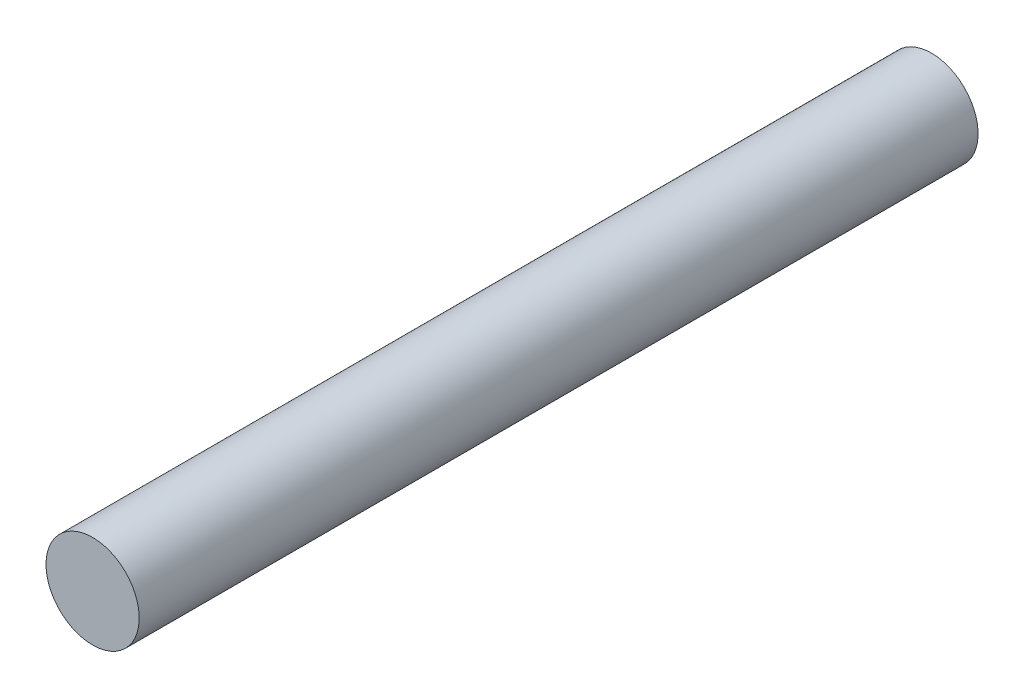
ISO-10303-21;
HEADER;
FILE_DESCRIPTION(('STEP AP214'),'2;1');
FILE_NAME('part.step','',(''),(''),'','','');
FILE_SCHEMA(('AUTOMOTIVE_DESIGN { 1 0 10303 214 1 1 1 1 }'));
ENDSEC;
DATA;
#1=APPLICATION_CONTEXT('core data for automotive mechanical design processes');
#2=APPLICATION_PROTOCOL_DEFINITION('international standard','automotive_design',2000,#1);
#3=PRODUCT_CONTEXT('',#1,'mechanical');
#4=PRODUCT('Part','Part','',(#3));
#5=PRODUCT_RELATED_PRODUCT_CATEGORY('part','',(#4));
#6=PRODUCT_DEFINITION_FORMATION('','',#4);
#7=PRODUCT_DEFINITION_CONTEXT('part definition',#1,'design');
#8=PRODUCT_DEFINITION('design','',#6,#7);
#9=PRODUCT_DEFINITION_SHAPE('','',#8);
#10=(LENGTH_UNIT() NAMED_UNIT(*) SI_UNIT(.MILLI.,.METRE.));
#11=(NAMED_UNIT(*) PLANE_ANGLE_UNIT() SI_UNIT($,.RADIAN.));
#12=(NAMED_UNIT(*) SI_UNIT($,.STERADIAN.) SOLID_ANGLE_UNIT());
#13=UNCERTAINTY_MEASURE_WITH_UNIT(LENGTH_MEASURE(1.E-05),#10,'distance_accuracy_value','');
#14=(GEOMETRIC_REPRESENTATION_CONTEXT(3) GLOBAL_UNCERTAINTY_ASSIGNED_CONTEXT((#13)) GLOBAL_UNIT_ASSIGNED_CONTEXT((#10,
#11,#12)) REPRESENTATION_CONTEXT('',''));
#15=CARTESIAN_POINT('',(0.,0.,0.));
#16=DIRECTION('',(0.,0.,1.));
#17=DIRECTION('',(1.,0.,0.));
#18=AXIS2_PLACEMENT_3D('',#15,#16,#17);
#19=CARTESIAN_POINT('',(0.,0.,180.));
#20=DIRECTION('',(0.,0.,-1.));
#21=DIRECTION('',(-1.,0.,0.));
#22=AXIS2_PLACEMENT_3D('',#19,#20,#21);
#23=CYLINDRICAL_SURFACE('',#22,10.);
#24=CARTESIAN_POINT('',(0.,0.,180.));
#25=DIRECTION('',(0.,0.,1.));
#26=DIRECTION('',(1.,0.,0.));
#27=AXIS2_PLACEMENT_3D('',#24,#25,#26);
#28=CIRCLE('',#27,10.);
#29=CARTESIAN_POINT('',(-10.,0.,180.));
#30=VERTEX_POINT('',#29);
#31=EDGE_CURVE('E10',#30,#30,#28,.T.);
#32=CARTESIAN_POINT('',(0.,0.,0.));
#33=DIRECTION('',(0.,0.,1.));
#34=DIRECTION('',(1.,0.,0.));
#35=AXIS2_PLACEMENT_3D('',#32,#33,#34);
#36=CIRCLE('',#35,10.);
#37=CARTESIAN_POINT('',(-10.,0.,0.));
#38=VERTEX_POINT('',#37);
#39=EDGE_CURVE('E34',#38,#38,#36,.T.);
#40=CARTESIAN_POINT('',(-10.,0.,180.));
#41=CARTESIAN_POINT('',(-10.,0.,178.125));
#42=CARTESIAN_POINT('',(-10.,0.,176.25));
#43=CARTESIAN_POINT('',(-10.,0.,172.5));
#44=CARTESIAN_POINT('',(-10.,0.,170.625));
#45=CARTESIAN_POINT('',(-10.,0.,166.875));
#46=CARTESIAN_POINT('',(-10.,0.,165.));
#47=CARTESIAN_POINT('',(-10.,0.,161.25));
#48=CARTESIAN_POINT('',(-10.,0.,159.375));
#49=CARTESIAN_POINT('',(-10.,0.,155.625));
#50=CARTESIAN_POINT('',(-10.,0.,153.75));
#51=CARTESIAN_POINT('',(-10.,0.,150.));
#52=CARTESIAN_POINT('',(-10.,0.,148.125));
#53=CARTESIAN_POINT('',(-10.,0.,144.375));
#54=CARTESIAN_POINT('',(-10.,0.,142.5));
#55=CARTESIAN_POINT('',(-10.,0.,138.75));
#56=CARTESIAN_POINT('',(-10.,0.,136.875));
#57=CARTESIAN_POINT('',(-10.,0.,133.125));
#58=CARTESIAN_POINT('',(-10.,0.,131.25));
#59=CARTESIAN_POINT('',(-10.,0.,127.5));
#60=CARTESIAN_POINT('',(-10.,0.,125.625));
#61=CARTESIAN_POINT('',(-10.,0.,121.875));
#62=CARTESIAN_POINT('',(-10.,0.,120.));
#63=CARTESIAN_POINT('',(-10.,0.,116.25));
#64=CARTESIAN_POINT('',(-10.,0.,114.375));
#65=CARTESIAN_POINT('',(-10.,0.,110.625));
#66=CARTESIAN_POINT('',(-10.,0.,108.75));
#67=CARTESIAN_POINT('',(-10.,0.,105.));
#68=CARTESIAN_POINT('',(-10.,0.,103.125));
#69=CARTESIAN_POINT('',(-10.,0.,99.375));
#70=CARTESIAN_POINT('',(-10.,0.,97.5));
#71=CARTESIAN_POINT('',(-10.,0.,93.75));
#72=CARTESIAN_POINT('',(-10.,0.,91.875));
#73=CARTESIAN_POINT('',(-10.,0.,88.125));
#74=CARTESIAN_POINT('',(-10.,0.,86.25));
#75=CARTESIAN_POINT('',(-10.,0.,82.5));
#76=CARTESIAN_POINT('',(-10.,0.,80.625));
#77=CARTESIAN_POINT('',(-10.,0.,76.875));
#78=CARTESIAN_POINT('',(-10.,0.,75.));
#79=CARTESIAN_POINT('',(-10.,0.,71.25));
#80=CARTESIAN_POINT('',(-10.,0.,69.375));
#81=CARTESIAN_POINT('',(-10.,0.,65.625));
#82=CARTESIAN_POINT('',(-10.,0.,63.75));
#83=CARTESIAN_POINT('',(-10.,0.,60.));
#84=CARTESIAN_POINT('',(-10.,0.,58.125));
#85=CARTESIAN_POINT('',(-10.,0.,54.375));
#86=CARTESIAN_POINT('',(-10.,0.,52.5));
#87=CARTESIAN_POINT('',(-10.,0.,48.75));
#88=CARTESIAN_POINT('',(-10.,0.,46.875));
#89=CARTESIAN_POINT('',(-10.,0.,43.125));
#90=CARTESIAN_POINT('',(-10.,0.,41.25));
#91=CARTESIAN_POINT('',(-10.,0.,37.5));
#92=CARTESIAN_POINT('',(-10.,0.,35.625));
#93=CARTESIAN_POINT('',(-10.,0.,31.875));
#94=CARTESIAN_POINT('',(-10.,0.,30.));
#95=CARTESIAN_POINT('',(-10.,0.,26.25));
#96=CARTESIAN_POINT('',(-10.,0.,24.375));
#97=CARTESIAN_POINT('',(-10.,0.,20.625));
#98=CARTESIAN_POINT('',(-10.,0.,18.75));
#99=CARTESIAN_POINT('',(-10.,0.,15.));
#100=CARTESIAN_POINT('',(-10.,0.,13.125));
#101=CARTESIAN_POINT('',(-10.,0.,9.37499999999998));
#102=CARTESIAN_POINT('',(-10.,0.,7.49999999999997));
#103=CARTESIAN_POINT('',(-10.,0.,3.74999999999997));
#104=CARTESIAN_POINT('',(-10.,0.,1.87499999999997));
#105=CARTESIAN_POINT('',(-10.,0.,0.));
#106=B_SPLINE_CURVE_WITH_KNOTS('',3,(#40,#41,#42,#43,#44,#45,#46,#47,#48,#49,#50,#51,#52,#53,
#54,#55,#56,#57,#58,#59,#60,#61,#62,#63,#64,#65,#66,#67,#68,#69,#70,#71,#72,#73,#74,#75,#76,#77,
#78,#79,#80,#81,#82,#83,#84,#85,#86,#87,#88,#89,#90,#91,#92,#93,#94,#95,#96,#97,#98,#99,#100,
#101,#102,#103,#104,#105),.UNSPECIFIED.,.F.,.F.,(4,2,2,2,2,2,2,2,2,2,2,2,2,2,2,2,2,2,2,2,2,2,2,
2,2,2,2,2,2,2,2,2,4),(0.,5.62499999999999,11.25,16.875,22.5,28.125,33.75,39.375,45.,50.625,
56.25,61.875,67.5,73.125,78.75,84.375,90.,95.625,101.25,106.875,112.5,118.125,123.75,129.375,
135.,140.625,146.25,151.875,157.5,163.125,168.75,174.375,180.),.UNSPECIFIED.);
#107=EDGE_CURVE('BSEAM31',#30,#38,#106,.T.);
#108=ORIENTED_EDGE('',*,*,#31,.F.);
#109=ORIENTED_EDGE('',*,*,#39,.T.);
#110=ORIENTED_EDGE('',*,*,#107,.T.);
#111=ORIENTED_EDGE('',*,*,#107,.F.);
#112=EDGE_LOOP('',(#108,#110,#109,#111));
#113=FACE_BOUND('',#112,.T.);
#114=ADVANCED_FACE('F31',(#113),#23,.T.);
#115=CARTESIAN_POINT('',(0.,0.,180.));
#116=DIRECTION('',(0.,0.,1.));
#117=DIRECTION('',(1.,0.,0.));
#118=AXIS2_PLACEMENT_3D('',#115,#116,#117);
#119=PLANE('',#118);
#120=ORIENTED_EDGE('',*,*,#31,.T.);
#121=EDGE_LOOP('',(#120));
#122=FACE_BOUND('',#121,.T.);
#123=ADVANCED_FACE('F46',(#122),#119,.T.);
#124=CARTESIAN_POINT('',(0.,0.,0.));
#125=DIRECTION('',(0.,0.,1.));
#126=DIRECTION('',(1.,0.,0.));
#127=AXIS2_PLACEMENT_3D('',#124,#125,#126);
#128=PLANE('',#127);
#129=ORIENTED_EDGE('',*,*,#39,.F.);
#130=EDGE_LOOP('',(#129));
#131=FACE_BOUND('',#130,.T.);
#132=ADVANCED_FACE('F44',(#131),#128,.F.);
#133=CLOSED_SHELL('',(#114,#123,#132));
#134=MANIFOLD_SOLID_BREP('B2',#133);
#135=ADVANCED_BREP_SHAPE_REPRESENTATION('',(#18,#134),#14);
#136=SHAPE_DEFINITION_REPRESENTATION(#9,#135);
ENDSEC;
END-ISO-10303-21;
